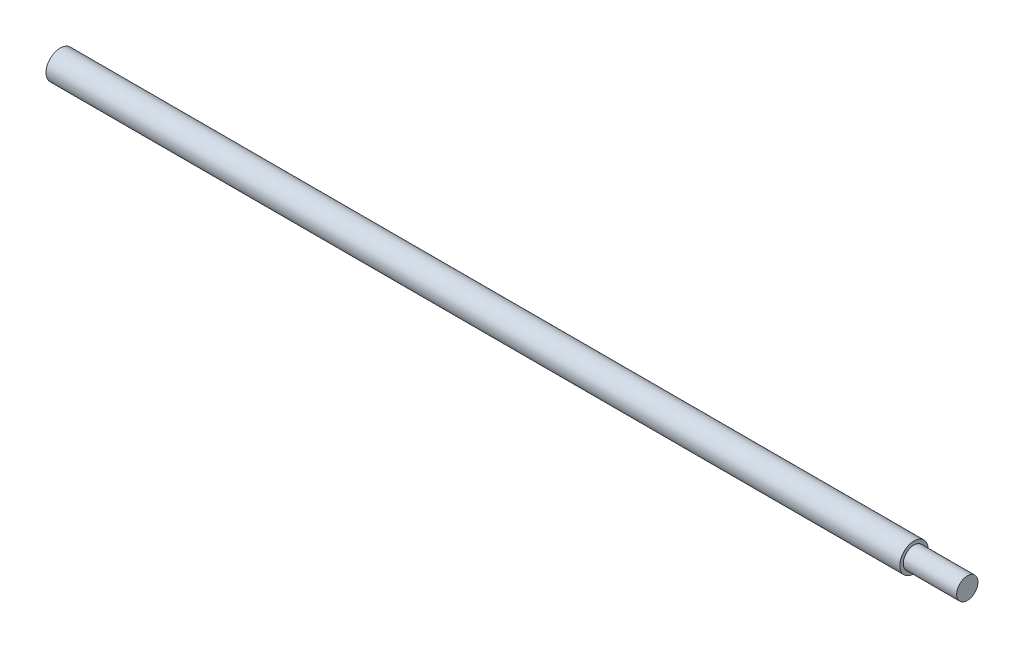
ISO-10303-21;
HEADER;
FILE_DESCRIPTION(('STEP AP214'),'2;1');
FILE_NAME('part.step','',(''),(''),'','','');
FILE_SCHEMA(('AUTOMOTIVE_DESIGN { 1 0 10303 214 1 1 1 1 }'));
ENDSEC;
DATA;
#1=APPLICATION_CONTEXT('core data for automotive mechanical design processes');
#2=APPLICATION_PROTOCOL_DEFINITION('international standard','automotive_design',2000,#1);
#3=PRODUCT_CONTEXT('',#1,'mechanical');
#4=PRODUCT('Part','Part','',(#3));
#5=PRODUCT_RELATED_PRODUCT_CATEGORY('part','',(#4));
#6=PRODUCT_DEFINITION_FORMATION('','',#4);
#7=PRODUCT_DEFINITION_CONTEXT('part definition',#1,'design');
#8=PRODUCT_DEFINITION('design','',#6,#7);
#9=PRODUCT_DEFINITION_SHAPE('','',#8);
#10=(LENGTH_UNIT() NAMED_UNIT(*) SI_UNIT(.MILLI.,.METRE.));
#11=(NAMED_UNIT(*) PLANE_ANGLE_UNIT() SI_UNIT($,.RADIAN.));
#12=(NAMED_UNIT(*) SI_UNIT($,.STERADIAN.) SOLID_ANGLE_UNIT());
#13=UNCERTAINTY_MEASURE_WITH_UNIT(LENGTH_MEASURE(1.E-05),#10,'distance_accuracy_value','');
#14=(GEOMETRIC_REPRESENTATION_CONTEXT(3) GLOBAL_UNCERTAINTY_ASSIGNED_CONTEXT((#13)) GLOBAL_UNIT_ASSIGNED_CONTEXT((#10,
#11,#12)) REPRESENTATION_CONTEXT('',''));
#15=CARTESIAN_POINT('',(0.,0.,0.));
#16=DIRECTION('',(0.,0.,1.));
#17=DIRECTION('',(1.,0.,0.));
#18=AXIS2_PLACEMENT_3D('',#15,#16,#17);
#19=CARTESIAN_POINT('',(-127.5,0.,0.));
#20=DIRECTION('',(-1.,0.,0.));
#21=DIRECTION('',(0.,0.,1.));
#22=AXIS2_PLACEMENT_3D('',#19,#20,#21);
#23=PLANE('',#22);
#24=CARTESIAN_POINT('',(-127.5,0.,0.));
#25=DIRECTION('',(1.,0.,0.));
#26=DIRECTION('',(0.,0.,-1.));
#27=AXIS2_PLACEMENT_3D('',#24,#25,#26);
#28=CIRCLE('',#27,3.99999999999995);
#29=CARTESIAN_POINT('',(-127.5,0.,-3.99999999999995));
#30=VERTEX_POINT('',#29);
#31=EDGE_CURVE('E10',#30,#30,#28,.T.);
#32=ORIENTED_EDGE('',*,*,#31,.F.);
#33=EDGE_LOOP('',(#32));
#34=FACE_BOUND('',#33,.T.);
#35=ADVANCED_FACE('F39',(#34),#23,.T.);
#36=CARTESIAN_POINT('',(277.081919690945,0.,0.));
#37=DIRECTION('',(1.,0.,0.));
#38=DIRECTION('',(0.,0.,-1.));
#39=AXIS2_PLACEMENT_3D('',#36,#37,#38);
#40=CYLINDRICAL_SURFACE('',#39,3.99999999999995);
#41=ORIENTED_EDGE('',*,*,#31,.T.);
#42=EDGE_LOOP('',(#41));
#43=FACE_BOUND('',#42,.T.);
#44=CARTESIAN_POINT('',(112.5,0.,0.));
#45=DIRECTION('',(1.,0.,0.));
#46=DIRECTION('',(0.,0.,-1.));
#47=AXIS2_PLACEMENT_3D('',#44,#45,#46);
#48=CIRCLE('',#47,3.99999999999995);
#49=CARTESIAN_POINT('',(112.5,0.,-3.99999999999995));
#50=VERTEX_POINT('',#49);
#51=EDGE_CURVE('E45',#50,#50,#48,.T.);
#52=ORIENTED_EDGE('',*,*,#51,.F.);
#53=EDGE_LOOP('',(#52));
#54=FACE_BOUND('',#53,.T.);
#55=ADVANCED_FACE('F71',(#43,#54),#40,.T.);
#56=CARTESIAN_POINT('',(112.5,3.99999999999995,0.));
#57=DIRECTION('',(1.,0.,0.));
#58=DIRECTION('',(0.,0.,-1.));
#59=AXIS2_PLACEMENT_3D('',#56,#57,#58);
#60=PLANE('',#59);
#61=ORIENTED_EDGE('',*,*,#51,.T.);
#62=EDGE_LOOP('',(#61));
#63=FACE_BOUND('',#62,.T.);
#64=CARTESIAN_POINT('',(112.5,0.,0.));
#65=DIRECTION('',(1.,0.,0.));
#66=DIRECTION('',(0.,0.,-1.));
#67=AXIS2_PLACEMENT_3D('',#64,#65,#66);
#68=CIRCLE('',#67,2.99999999999998);
#69=CARTESIAN_POINT('',(112.5,0.,-2.99999999999998));
#70=VERTEX_POINT('',#69);
#71=EDGE_CURVE('E49',#70,#70,#68,.T.);
#72=ORIENTED_EDGE('',*,*,#71,.F.);
#73=EDGE_LOOP('',(#72));
#74=FACE_BOUND('',#73,.T.);
#75=ADVANCED_FACE('F63',(#63,#74),#60,.T.);
#76=CARTESIAN_POINT('',(277.081919690945,0.,0.));
#77=DIRECTION('',(1.,0.,0.));
#78=DIRECTION('',(0.,0.,-1.));
#79=AXIS2_PLACEMENT_3D('',#76,#77,#78);
#80=CYLINDRICAL_SURFACE('',#79,2.99999999999998);
#81=ORIENTED_EDGE('',*,*,#71,.T.);
#82=EDGE_LOOP('',(#81));
#83=FACE_BOUND('',#82,.T.);
#84=CARTESIAN_POINT('',(127.5,0.,0.));
#85=DIRECTION('',(1.,0.,0.));
#86=DIRECTION('',(0.,0.,-1.));
#87=AXIS2_PLACEMENT_3D('',#84,#85,#86);
#88=CIRCLE('',#87,2.99999999999998);
#89=CARTESIAN_POINT('',(127.5,0.,-2.99999999999998));
#90=VERTEX_POINT('',#89);
#91=EDGE_CURVE('E53',#90,#90,#88,.T.);
#92=ORIENTED_EDGE('',*,*,#91,.F.);
#93=EDGE_LOOP('',(#92));
#94=FACE_BOUND('',#93,.T.);
#95=ADVANCED_FACE('F61',(#83,#94),#80,.T.);
#96=CARTESIAN_POINT('',(127.5,2.99999999999998,0.));
#97=DIRECTION('',(1.,0.,0.));
#98=DIRECTION('',(0.,0.,-1.));
#99=AXIS2_PLACEMENT_3D('',#96,#97,#98);
#100=PLANE('',#99);
#101=ORIENTED_EDGE('',*,*,#91,.T.);
#102=EDGE_LOOP('',(#101));
#103=FACE_BOUND('',#102,.T.);
#104=ADVANCED_FACE('F59',(#103),#100,.T.);
#105=CLOSED_SHELL('',(#35,#55,#75,#95,#104));
#106=MANIFOLD_SOLID_BREP('B2',#105);
#107=ADVANCED_BREP_SHAPE_REPRESENTATION('',(#18,#106),#14);
#108=SHAPE_DEFINITION_REPRESENTATION(#9,#107);
ENDSEC;
END-ISO-10303-21;
